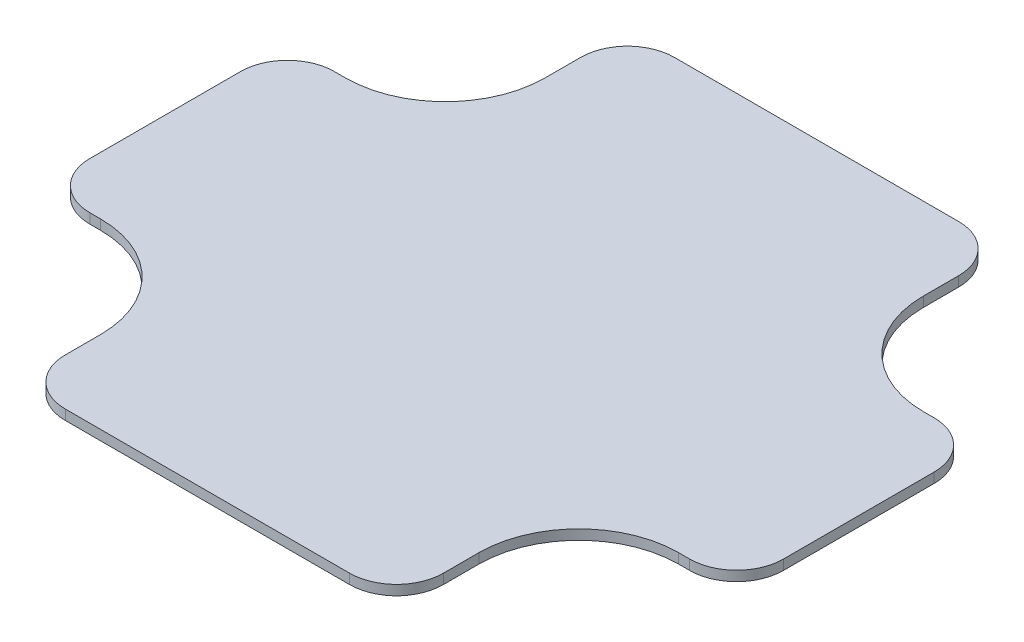
ISO-10303-21;
HEADER;
FILE_DESCRIPTION(('STEP AP214'),'2;1');
FILE_NAME('part.step','',(''),(''),'','','');
FILE_SCHEMA(('AUTOMOTIVE_DESIGN { 1 0 10303 214 1 1 1 1 }'));
ENDSEC;
DATA;
#1=APPLICATION_CONTEXT('core data for automotive mechanical design processes');
#2=APPLICATION_PROTOCOL_DEFINITION('international standard','automotive_design',2000,#1);
#3=PRODUCT_CONTEXT('',#1,'mechanical');
#4=PRODUCT('Part','Part','',(#3));
#5=PRODUCT_RELATED_PRODUCT_CATEGORY('part','',(#4));
#6=PRODUCT_DEFINITION_FORMATION('','',#4);
#7=PRODUCT_DEFINITION_CONTEXT('part definition',#1,'design');
#8=PRODUCT_DEFINITION('design','',#6,#7);
#9=PRODUCT_DEFINITION_SHAPE('','',#8);
#10=(LENGTH_UNIT() NAMED_UNIT(*) SI_UNIT(.MILLI.,.METRE.));
#11=(NAMED_UNIT(*) PLANE_ANGLE_UNIT() SI_UNIT($,.RADIAN.));
#12=(NAMED_UNIT(*) SI_UNIT($,.STERADIAN.) SOLID_ANGLE_UNIT());
#13=UNCERTAINTY_MEASURE_WITH_UNIT(LENGTH_MEASURE(1.E-05),#10,'distance_accuracy_value','');
#14=(GEOMETRIC_REPRESENTATION_CONTEXT(3) GLOBAL_UNCERTAINTY_ASSIGNED_CONTEXT((#13)) GLOBAL_UNIT_ASSIGNED_CONTEXT((#10,
#11,#12)) REPRESENTATION_CONTEXT('',''));
#15=CARTESIAN_POINT('',(0.,0.,0.));
#16=DIRECTION('',(0.,0.,1.));
#17=DIRECTION('',(1.,0.,0.));
#18=AXIS2_PLACEMENT_3D('',#15,#16,#17);
#19=CARTESIAN_POINT('',(45.5,3.175,-82.46855));
#20=DIRECTION('',(0.,-1.,0.));
#21=DIRECTION('',(0.,0.,-1.));
#22=AXIS2_PLACEMENT_3D('',#19,#20,#21);
#23=CYLINDRICAL_SURFACE('',#22,15.);
#24=CARTESIAN_POINT('',(45.5,0.,-82.46855));
#25=DIRECTION('',(0.,1.,0.));
#26=DIRECTION('',(0.,0.,1.));
#27=AXIS2_PLACEMENT_3D('',#24,#25,#26);
#28=CIRCLE('',#27,15.);
#29=CARTESIAN_POINT('',(60.5,0.,-82.46855));
#30=VERTEX_POINT('',#29);
#31=CARTESIAN_POINT('',(45.5,0.,-97.46855));
#32=VERTEX_POINT('',#31);
#33=EDGE_CURVE('E225',#30,#32,#28,.T.);
#34=ORIENTED_EDGE('',*,*,#33,.T.);
#35=DIRECTION('',(0.,-1.,0.));
#36=VECTOR('',#35,1.);
#37=CARTESIAN_POINT('',(45.5,3.175,-97.46855));
#38=LINE('',#37,#36);
#39=CARTESIAN_POINT('',(45.5,3.175,-97.46855));
#40=VERTEX_POINT('',#39);
#41=EDGE_CURVE('E11',#40,#32,#38,.T.);
#42=ORIENTED_EDGE('',*,*,#41,.F.);
#43=CARTESIAN_POINT('',(45.5,3.175,-82.46855));
#44=DIRECTION('',(0.,1.,0.));
#45=DIRECTION('',(0.,0.,1.));
#46=AXIS2_PLACEMENT_3D('',#43,#44,#45);
#47=CIRCLE('',#46,15.);
#48=CARTESIAN_POINT('',(60.5,3.175,-82.46855));
#49=VERTEX_POINT('',#48);
#50=EDGE_CURVE('E271',#49,#40,#47,.T.);
#51=ORIENTED_EDGE('',*,*,#50,.F.);
#52=DIRECTION('',(0.,-1.,0.));
#53=VECTOR('',#52,1.);
#54=CARTESIAN_POINT('',(60.5,3.175,-82.46855));
#55=LINE('',#54,#53);
#56=EDGE_CURVE('E221',#49,#30,#55,.T.);
#57=ORIENTED_EDGE('',*,*,#56,.T.);
#58=EDGE_LOOP('',(#34,#42,#51,#57));
#59=FACE_BOUND('',#58,.T.);
#60=ADVANCED_FACE('F33',(#59),#23,.T.);
#61=CARTESIAN_POINT('',(-45.5,3.175,-97.46855));
#62=DIRECTION('',(0.,0.,1.));
#63=DIRECTION('',(1.,0.,0.));
#64=AXIS2_PLACEMENT_3D('',#61,#62,#63);
#65=PLANE('',#64);
#66=DIRECTION('',(-1.,0.,0.));
#67=VECTOR('',#66,1.);
#68=CARTESIAN_POINT('',(-45.5,0.,-97.46855));
#69=LINE('',#68,#67);
#70=CARTESIAN_POINT('',(-45.5,0.,-97.46855));
#71=VERTEX_POINT('',#70);
#72=EDGE_CURVE('E228',#32,#71,#69,.T.);
#73=ORIENTED_EDGE('',*,*,#72,.T.);
#74=DIRECTION('',(0.,-1.,0.));
#75=VECTOR('',#74,1.);
#76=CARTESIAN_POINT('',(-45.5,3.175,-97.46855));
#77=LINE('',#76,#75);
#78=CARTESIAN_POINT('',(-45.5,3.175,-97.46855));
#79=VERTEX_POINT('',#78);
#80=EDGE_CURVE('E41',#79,#71,#77,.T.);
#81=ORIENTED_EDGE('',*,*,#80,.F.);
#82=DIRECTION('',(-1.,0.,0.));
#83=VECTOR('',#82,1.);
#84=CARTESIAN_POINT('',(-45.5,3.175,-97.46855));
#85=LINE('',#84,#83);
#86=EDGE_CURVE('E140',#40,#79,#85,.T.);
#87=ORIENTED_EDGE('',*,*,#86,.F.);
#88=ORIENTED_EDGE('',*,*,#41,.T.);
#89=EDGE_LOOP('',(#73,#81,#87,#88));
#90=FACE_BOUND('',#89,.T.);
#91=ADVANCED_FACE('F409',(#90),#65,.F.);
#92=CARTESIAN_POINT('',(-45.5,3.175,-82.46855));
#93=DIRECTION('',(0.,-1.,0.));
#94=DIRECTION('',(0.,0.,-1.));
#95=AXIS2_PLACEMENT_3D('',#92,#93,#94);
#96=CYLINDRICAL_SURFACE('',#95,15.);
#97=CARTESIAN_POINT('',(-45.5,0.,-82.46855));
#98=DIRECTION('',(0.,1.,0.));
#99=DIRECTION('',(0.,0.,-1.));
#100=AXIS2_PLACEMENT_3D('',#97,#98,#99);
#101=CIRCLE('',#100,15.);
#102=CARTESIAN_POINT('',(-60.5,0.,-82.46855));
#103=VERTEX_POINT('',#102);
#104=EDGE_CURVE('E230',#71,#103,#101,.T.);
#105=ORIENTED_EDGE('',*,*,#104,.T.);
#106=DIRECTION('',(0.,-1.,0.));
#107=VECTOR('',#106,1.);
#108=CARTESIAN_POINT('',(-60.5,3.175,-82.46855));
#109=LINE('',#108,#107);
#110=CARTESIAN_POINT('',(-60.5,3.175,-82.46855));
#111=VERTEX_POINT('',#110);
#112=EDGE_CURVE('E326',#111,#103,#109,.T.);
#113=ORIENTED_EDGE('',*,*,#112,.F.);
#114=CARTESIAN_POINT('',(-45.5,3.175,-82.46855));
#115=DIRECTION('',(0.,1.,0.));
#116=DIRECTION('',(0.,0.,-1.));
#117=AXIS2_PLACEMENT_3D('',#114,#115,#116);
#118=CIRCLE('',#117,15.);
#119=EDGE_CURVE('E334',#79,#111,#118,.T.);
#120=ORIENTED_EDGE('',*,*,#119,.F.);
#121=ORIENTED_EDGE('',*,*,#80,.T.);
#122=EDGE_LOOP('',(#105,#113,#120,#121));
#123=FACE_BOUND('',#122,.T.);
#124=ADVANCED_FACE('F332',(#123),#96,.T.);
#125=CARTESIAN_POINT('',(-60.5,3.175,-71.13235));
#126=DIRECTION('',(1.,0.,0.));
#127=DIRECTION('',(0.,0.,-1.));
#128=AXIS2_PLACEMENT_3D('',#125,#126,#127);
#129=PLANE('',#128);
#130=DIRECTION('',(0.,0.,1.));
#131=VECTOR('',#130,1.);
#132=CARTESIAN_POINT('',(-60.5,0.,-71.13235));
#133=LINE('',#132,#131);
#134=CARTESIAN_POINT('',(-60.5,0.,-71.13235));
#135=VERTEX_POINT('',#134);
#136=EDGE_CURVE('E232',#103,#135,#133,.T.);
#137=ORIENTED_EDGE('',*,*,#136,.T.);
#138=DIRECTION('',(0.,-1.,0.));
#139=VECTOR('',#138,1.);
#140=CARTESIAN_POINT('',(-60.5,3.175,-71.13235));
#141=LINE('',#140,#139);
#142=CARTESIAN_POINT('',(-60.5,3.175,-71.13235));
#143=VERTEX_POINT('',#142);
#144=EDGE_CURVE('E323',#143,#135,#141,.T.);
#145=ORIENTED_EDGE('',*,*,#144,.F.);
#146=DIRECTION('',(0.,0.,1.));
#147=VECTOR('',#146,1.);
#148=CARTESIAN_POINT('',(-60.5,3.175,-71.13235));
#149=LINE('',#148,#147);
#150=EDGE_CURVE('E352',#111,#143,#149,.T.);
#151=ORIENTED_EDGE('',*,*,#150,.F.);
#152=ORIENTED_EDGE('',*,*,#112,.T.);
#153=EDGE_LOOP('',(#137,#145,#151,#152));
#154=FACE_BOUND('',#153,.T.);
#155=ADVANCED_FACE('F343',(#154),#129,.F.);
#156=CARTESIAN_POINT('',(-92.5,3.175,-71.13235));
#157=DIRECTION('',(0.,-1.,0.));
#158=DIRECTION('',(0.,0.,-1.));
#159=AXIS2_PLACEMENT_3D('',#156,#157,#158);
#160=CYLINDRICAL_SURFACE('',#159,32.);
#161=CARTESIAN_POINT('',(-92.5,0.,-71.13235));
#162=DIRECTION('',(0.,-1.,0.));
#163=DIRECTION('',(0.,0.,1.));
#164=AXIS2_PLACEMENT_3D('',#161,#162,#163);
#165=CIRCLE('',#164,32.);
#166=CARTESIAN_POINT('',(-92.5,0.,-39.13235));
#167=VERTEX_POINT('',#166);
#168=EDGE_CURVE('E234',#135,#167,#165,.T.);
#169=ORIENTED_EDGE('',*,*,#168,.T.);
#170=DIRECTION('',(0.,-1.,0.));
#171=VECTOR('',#170,1.);
#172=CARTESIAN_POINT('',(-92.5,3.175,-39.13235));
#173=LINE('',#172,#171);
#174=CARTESIAN_POINT('',(-92.5,3.175,-39.13235));
#175=VERTEX_POINT('',#174);
#176=EDGE_CURVE('E320',#175,#167,#173,.T.);
#177=ORIENTED_EDGE('',*,*,#176,.F.);
#178=CARTESIAN_POINT('',(-92.5,3.175,-71.13235));
#179=DIRECTION('',(0.,-1.,0.));
#180=DIRECTION('',(0.,0.,1.));
#181=AXIS2_PLACEMENT_3D('',#178,#179,#180);
#182=CIRCLE('',#181,32.);
#183=EDGE_CURVE('E349',#143,#175,#182,.T.);
#184=ORIENTED_EDGE('',*,*,#183,.F.);
#185=ORIENTED_EDGE('',*,*,#144,.T.);
#186=EDGE_LOOP('',(#169,#177,#184,#185));
#187=FACE_BOUND('',#186,.T.);
#188=ADVANCED_FACE('F347',(#187),#160,.F.);
#189=CARTESIAN_POINT('',(-96.,3.175,-39.13235));
#190=DIRECTION('',(0.,0.,1.));
#191=DIRECTION('',(1.,0.,0.));
#192=AXIS2_PLACEMENT_3D('',#189,#190,#191);
#193=PLANE('',#192);
#194=DIRECTION('',(-1.,0.,0.));
#195=VECTOR('',#194,1.);
#196=CARTESIAN_POINT('',(-96.,0.,-39.13235));
#197=LINE('',#196,#195);
#198=CARTESIAN_POINT('',(-96.,0.,-39.13235));
#199=VERTEX_POINT('',#198);
#200=EDGE_CURVE('E236',#167,#199,#197,.T.);
#201=ORIENTED_EDGE('',*,*,#200,.T.);
#202=DIRECTION('',(0.,-1.,0.));
#203=VECTOR('',#202,1.);
#204=CARTESIAN_POINT('',(-96.,3.175,-39.13235));
#205=LINE('',#204,#203);
#206=CARTESIAN_POINT('',(-96.,3.175,-39.13235));
#207=VERTEX_POINT('',#206);
#208=EDGE_CURVE('E317',#207,#199,#205,.T.);
#209=ORIENTED_EDGE('',*,*,#208,.F.);
#210=DIRECTION('',(-1.,0.,0.));
#211=VECTOR('',#210,1.);
#212=CARTESIAN_POINT('',(-96.,3.175,-39.13235));
#213=LINE('',#212,#211);
#214=EDGE_CURVE('E351',#175,#207,#213,.T.);
#215=ORIENTED_EDGE('',*,*,#214,.F.);
#216=ORIENTED_EDGE('',*,*,#176,.T.);
#217=EDGE_LOOP('',(#201,#209,#215,#216));
#218=FACE_BOUND('',#217,.T.);
#219=ADVANCED_FACE('F422',(#218),#193,.F.);
#220=CARTESIAN_POINT('',(-96.,3.175,-24.13235));
#221=DIRECTION('',(0.,-1.,0.));
#222=DIRECTION('',(0.,0.,-1.));
#223=AXIS2_PLACEMENT_3D('',#220,#221,#222);
#224=CYLINDRICAL_SURFACE('',#223,15.);
#225=CARTESIAN_POINT('',(-96.,0.,-24.13235));
#226=DIRECTION('',(0.,1.,0.));
#227=DIRECTION('',(0.,0.,-1.));
#228=AXIS2_PLACEMENT_3D('',#225,#226,#227);
#229=CIRCLE('',#228,15.);
#230=CARTESIAN_POINT('',(-111.,0.,-24.13235));
#231=VERTEX_POINT('',#230);
#232=EDGE_CURVE('E238',#199,#231,#229,.T.);
#233=ORIENTED_EDGE('',*,*,#232,.T.);
#234=DIRECTION('',(0.,-1.,0.));
#235=VECTOR('',#234,1.);
#236=CARTESIAN_POINT('',(-111.,3.175,-24.13235));
#237=LINE('',#236,#235);
#238=CARTESIAN_POINT('',(-111.,3.175,-24.13235));
#239=VERTEX_POINT('',#238);
#240=EDGE_CURVE('E314',#239,#231,#237,.T.);
#241=ORIENTED_EDGE('',*,*,#240,.F.);
#242=CARTESIAN_POINT('',(-96.,3.175,-24.13235));
#243=DIRECTION('',(0.,1.,0.));
#244=DIRECTION('',(0.,0.,-1.));
#245=AXIS2_PLACEMENT_3D('',#242,#243,#244);
#246=CIRCLE('',#245,15.);
#247=EDGE_CURVE('E354',#207,#239,#246,.T.);
#248=ORIENTED_EDGE('',*,*,#247,.F.);
#249=ORIENTED_EDGE('',*,*,#208,.T.);
#250=EDGE_LOOP('',(#233,#241,#248,#249));
#251=FACE_BOUND('',#250,.T.);
#252=ADVANCED_FACE('F425',(#251),#224,.T.);
#253=CARTESIAN_POINT('',(-111.,3.175,24.13235));
#254=DIRECTION('',(1.,0.,0.));
#255=DIRECTION('',(0.,0.,-1.));
#256=AXIS2_PLACEMENT_3D('',#253,#254,#255);
#257=PLANE('',#256);
#258=DIRECTION('',(0.,0.,1.));
#259=VECTOR('',#258,1.);
#260=CARTESIAN_POINT('',(-111.,0.,24.13235));
#261=LINE('',#260,#259);
#262=CARTESIAN_POINT('',(-111.,0.,24.13235));
#263=VERTEX_POINT('',#262);
#264=EDGE_CURVE('E240',#231,#263,#261,.T.);
#265=ORIENTED_EDGE('',*,*,#264,.T.);
#266=DIRECTION('',(0.,-1.,0.));
#267=VECTOR('',#266,1.);
#268=CARTESIAN_POINT('',(-111.,3.175,24.13235));
#269=LINE('',#268,#267);
#270=CARTESIAN_POINT('',(-111.,3.175,24.13235));
#271=VERTEX_POINT('',#270);
#272=EDGE_CURVE('E311',#271,#263,#269,.T.);
#273=ORIENTED_EDGE('',*,*,#272,.F.);
#274=DIRECTION('',(0.,0.,1.));
#275=VECTOR('',#274,1.);
#276=CARTESIAN_POINT('',(-111.,3.175,24.13235));
#277=LINE('',#276,#275);
#278=EDGE_CURVE('E360',#239,#271,#277,.T.);
#279=ORIENTED_EDGE('',*,*,#278,.F.);
#280=ORIENTED_EDGE('',*,*,#240,.T.);
#281=EDGE_LOOP('',(#265,#273,#279,#280));
#282=FACE_BOUND('',#281,.T.);
#283=ADVANCED_FACE('F429',(#282),#257,.F.);
#284=CARTESIAN_POINT('',(-96.,3.175,24.13235));
#285=DIRECTION('',(0.,-1.,0.));
#286=DIRECTION('',(0.,0.,-1.));
#287=AXIS2_PLACEMENT_3D('',#284,#285,#286);
#288=CYLINDRICAL_SURFACE('',#287,15.);
#289=CARTESIAN_POINT('',(-96.,0.,24.13235));
#290=DIRECTION('',(0.,1.,0.));
#291=DIRECTION('',(0.,0.,1.));
#292=AXIS2_PLACEMENT_3D('',#289,#290,#291);
#293=CIRCLE('',#292,15.);
#294=CARTESIAN_POINT('',(-96.,0.,39.13235));
#295=VERTEX_POINT('',#294);
#296=EDGE_CURVE('E242',#263,#295,#293,.T.);
#297=ORIENTED_EDGE('',*,*,#296,.T.);
#298=DIRECTION('',(0.,-1.,0.));
#299=VECTOR('',#298,1.);
#300=CARTESIAN_POINT('',(-96.,3.175,39.13235));
#301=LINE('',#300,#299);
#302=CARTESIAN_POINT('',(-96.,3.175,39.13235));
#303=VERTEX_POINT('',#302);
#304=EDGE_CURVE('E308',#303,#295,#301,.T.);
#305=ORIENTED_EDGE('',*,*,#304,.F.);
#306=CARTESIAN_POINT('',(-96.,3.175,24.13235));
#307=DIRECTION('',(0.,1.,0.));
#308=DIRECTION('',(0.,0.,1.));
#309=AXIS2_PLACEMENT_3D('',#306,#307,#308);
#310=CIRCLE('',#309,15.);
#311=EDGE_CURVE('E362',#271,#303,#310,.T.);
#312=ORIENTED_EDGE('',*,*,#311,.F.);
#313=ORIENTED_EDGE('',*,*,#272,.T.);
#314=EDGE_LOOP('',(#297,#305,#312,#313));
#315=FACE_BOUND('',#314,.T.);
#316=ADVANCED_FACE('F433',(#315),#288,.T.);
#317=CARTESIAN_POINT('',(-96.,3.175,39.13235));
#318=DIRECTION('',(0.,0.,-1.));
#319=DIRECTION('',(-1.,0.,0.));
#320=AXIS2_PLACEMENT_3D('',#317,#318,#319);
#321=PLANE('',#320);
#322=DIRECTION('',(1.,0.,0.));
#323=VECTOR('',#322,1.);
#324=CARTESIAN_POINT('',(-96.,0.,39.13235));
#325=LINE('',#324,#323);
#326=CARTESIAN_POINT('',(-92.5,0.,39.13235));
#327=VERTEX_POINT('',#326);
#328=EDGE_CURVE('E244',#295,#327,#325,.T.);
#329=ORIENTED_EDGE('',*,*,#328,.T.);
#330=DIRECTION('',(0.,-1.,0.));
#331=VECTOR('',#330,1.);
#332=CARTESIAN_POINT('',(-92.5,3.175,39.13235));
#333=LINE('',#332,#331);
#334=CARTESIAN_POINT('',(-92.5,3.175,39.13235));
#335=VERTEX_POINT('',#334);
#336=EDGE_CURVE('E305',#335,#327,#333,.T.);
#337=ORIENTED_EDGE('',*,*,#336,.F.);
#338=DIRECTION('',(1.,0.,0.));
#339=VECTOR('',#338,1.);
#340=CARTESIAN_POINT('',(-96.,3.175,39.13235));
#341=LINE('',#340,#339);
#342=EDGE_CURVE('E364',#303,#335,#341,.T.);
#343=ORIENTED_EDGE('',*,*,#342,.F.);
#344=ORIENTED_EDGE('',*,*,#304,.T.);
#345=EDGE_LOOP('',(#329,#337,#343,#344));
#346=FACE_BOUND('',#345,.T.);
#347=ADVANCED_FACE('F437',(#346),#321,.F.);
#348=CARTESIAN_POINT('',(-92.5,3.175,71.13235));
#349=DIRECTION('',(0.,-1.,0.));
#350=DIRECTION('',(0.,0.,-1.));
#351=AXIS2_PLACEMENT_3D('',#348,#349,#350);
#352=CYLINDRICAL_SURFACE('',#351,32.);
#353=CARTESIAN_POINT('',(-92.5,0.,71.13235));
#354=DIRECTION('',(0.,-1.,0.));
#355=DIRECTION('',(0.,0.,-1.));
#356=AXIS2_PLACEMENT_3D('',#353,#354,#355);
#357=CIRCLE('',#356,32.);
#358=CARTESIAN_POINT('',(-60.5,0.,71.13235));
#359=VERTEX_POINT('',#358);
#360=EDGE_CURVE('E246',#327,#359,#357,.T.);
#361=ORIENTED_EDGE('',*,*,#360,.T.);
#362=DIRECTION('',(0.,-1.,0.));
#363=VECTOR('',#362,1.);
#364=CARTESIAN_POINT('',(-60.5,3.175,71.13235));
#365=LINE('',#364,#363);
#366=CARTESIAN_POINT('',(-60.5,3.175,71.13235));
#367=VERTEX_POINT('',#366);
#368=EDGE_CURVE('E302',#367,#359,#365,.T.);
#369=ORIENTED_EDGE('',*,*,#368,.F.);
#370=CARTESIAN_POINT('',(-92.5,3.175,71.13235));
#371=DIRECTION('',(0.,-1.,0.));
#372=DIRECTION('',(0.,0.,-1.));
#373=AXIS2_PLACEMENT_3D('',#370,#371,#372);
#374=CIRCLE('',#373,32.);
#375=EDGE_CURVE('E366',#335,#367,#374,.T.);
#376=ORIENTED_EDGE('',*,*,#375,.F.);
#377=ORIENTED_EDGE('',*,*,#336,.T.);
#378=EDGE_LOOP('',(#361,#369,#376,#377));
#379=FACE_BOUND('',#378,.T.);
#380=ADVANCED_FACE('F441',(#379),#352,.F.);
#381=CARTESIAN_POINT('',(-60.5,3.175,71.13235));
#382=DIRECTION('',(1.,0.,0.));
#383=DIRECTION('',(0.,0.,-1.));
#384=AXIS2_PLACEMENT_3D('',#381,#382,#383);
#385=PLANE('',#384);
#386=DIRECTION('',(0.,0.,1.));
#387=VECTOR('',#386,1.);
#388=CARTESIAN_POINT('',(-60.5,0.,71.13235));
#389=LINE('',#388,#387);
#390=CARTESIAN_POINT('',(-60.5,0.,82.46855));
#391=VERTEX_POINT('',#390);
#392=EDGE_CURVE('E248',#359,#391,#389,.T.);
#393=ORIENTED_EDGE('',*,*,#392,.T.);
#394=DIRECTION('',(0.,-1.,0.));
#395=VECTOR('',#394,1.);
#396=CARTESIAN_POINT('',(-60.5,3.175,82.46855));
#397=LINE('',#396,#395);
#398=CARTESIAN_POINT('',(-60.5,3.175,82.46855));
#399=VERTEX_POINT('',#398);
#400=EDGE_CURVE('E299',#399,#391,#397,.T.);
#401=ORIENTED_EDGE('',*,*,#400,.F.);
#402=DIRECTION('',(0.,0.,1.));
#403=VECTOR('',#402,1.);
#404=CARTESIAN_POINT('',(-60.5,3.175,71.13235));
#405=LINE('',#404,#403);
#406=EDGE_CURVE('E368',#367,#399,#405,.T.);
#407=ORIENTED_EDGE('',*,*,#406,.F.);
#408=ORIENTED_EDGE('',*,*,#368,.T.);
#409=EDGE_LOOP('',(#393,#401,#407,#408));
#410=FACE_BOUND('',#409,.T.);
#411=ADVANCED_FACE('F445',(#410),#385,.F.);
#412=CARTESIAN_POINT('',(-45.5,3.175,82.46855));
#413=DIRECTION('',(0.,-1.,0.));
#414=DIRECTION('',(0.,0.,-1.));
#415=AXIS2_PLACEMENT_3D('',#412,#413,#414);
#416=CYLINDRICAL_SURFACE('',#415,15.0000000000001);
#417=CARTESIAN_POINT('',(-45.5,0.,82.46855));
#418=DIRECTION('',(0.,1.,0.));
#419=DIRECTION('',(0.,0.,1.));
#420=AXIS2_PLACEMENT_3D('',#417,#418,#419);
#421=CIRCLE('',#420,15.0000000000001);
#422=CARTESIAN_POINT('',(-45.5,0.,97.4685500000001));
#423=VERTEX_POINT('',#422);
#424=EDGE_CURVE('E250',#391,#423,#421,.T.);
#425=ORIENTED_EDGE('',*,*,#424,.T.);
#426=DIRECTION('',(0.,-1.,0.));
#427=VECTOR('',#426,1.);
#428=CARTESIAN_POINT('',(-45.5,3.175,97.4685500000001));
#429=LINE('',#428,#427);
#430=CARTESIAN_POINT('',(-45.5,3.175,97.4685500000001));
#431=VERTEX_POINT('',#430);
#432=EDGE_CURVE('E296',#431,#423,#429,.T.);
#433=ORIENTED_EDGE('',*,*,#432,.F.);
#434=CARTESIAN_POINT('',(-45.5,3.175,82.46855));
#435=DIRECTION('',(0.,1.,0.));
#436=DIRECTION('',(0.,0.,1.));
#437=AXIS2_PLACEMENT_3D('',#434,#435,#436);
#438=CIRCLE('',#437,15.0000000000001);
#439=EDGE_CURVE('E370',#399,#431,#438,.T.);
#440=ORIENTED_EDGE('',*,*,#439,.F.);
#441=ORIENTED_EDGE('',*,*,#400,.T.);
#442=EDGE_LOOP('',(#425,#433,#440,#441));
#443=FACE_BOUND('',#442,.T.);
#444=ADVANCED_FACE('F449',(#443),#416,.T.);
#445=CARTESIAN_POINT('',(-45.5,3.175,97.4685500000003));
#446=DIRECTION('',(0.,0.,-1.));
#447=DIRECTION('',(-1.,0.,0.));
#448=AXIS2_PLACEMENT_3D('',#445,#446,#447);
#449=PLANE('',#448);
#450=DIRECTION('',(1.,0.,0.));
#451=VECTOR('',#450,1.);
#452=CARTESIAN_POINT('',(-45.5,0.,97.4685500000003));
#453=LINE('',#452,#451);
#454=CARTESIAN_POINT('',(45.5000000000001,0.,97.4685500000002));
#455=VERTEX_POINT('',#454);
#456=EDGE_CURVE('E252',#423,#455,#453,.T.);
#457=ORIENTED_EDGE('',*,*,#456,.T.);
#458=DIRECTION('',(0.,-1.,0.));
#459=VECTOR('',#458,1.);
#460=CARTESIAN_POINT('',(45.5000000000001,3.175,97.4685500000002));
#461=LINE('',#460,#459);
#462=CARTESIAN_POINT('',(45.5000000000001,3.175,97.4685500000002));
#463=VERTEX_POINT('',#462);
#464=EDGE_CURVE('E293',#463,#455,#461,.T.);
#465=ORIENTED_EDGE('',*,*,#464,.F.);
#466=DIRECTION('',(1.,0.,0.));
#467=VECTOR('',#466,1.);
#468=CARTESIAN_POINT('',(-45.5,3.175,97.4685500000003));
#469=LINE('',#468,#467);
#470=EDGE_CURVE('E372',#431,#463,#469,.T.);
#471=ORIENTED_EDGE('',*,*,#470,.F.);
#472=ORIENTED_EDGE('',*,*,#432,.T.);
#473=EDGE_LOOP('',(#457,#465,#471,#472));
#474=FACE_BOUND('',#473,.T.);
#475=ADVANCED_FACE('F453',(#474),#449,.F.);
#476=CARTESIAN_POINT('',(45.5,3.175,82.46855));
#477=DIRECTION('',(0.,-1.,0.));
#478=DIRECTION('',(0.,0.,-1.));
#479=AXIS2_PLACEMENT_3D('',#476,#477,#478);
#480=CYLINDRICAL_SURFACE('',#479,15.0000000000001);
#481=CARTESIAN_POINT('',(45.5,0.,82.46855));
#482=DIRECTION('',(0.,1.,0.));
#483=DIRECTION('',(0.,0.,-1.));
#484=AXIS2_PLACEMENT_3D('',#481,#482,#483);
#485=CIRCLE('',#484,15.0000000000001);
#486=CARTESIAN_POINT('',(60.5000000000001,0.,82.46855));
#487=VERTEX_POINT('',#486);
#488=EDGE_CURVE('E254',#455,#487,#485,.T.);
#489=ORIENTED_EDGE('',*,*,#488,.T.);
#490=DIRECTION('',(0.,-1.,0.));
#491=VECTOR('',#490,1.);
#492=CARTESIAN_POINT('',(60.5000000000001,3.175,82.46855));
#493=LINE('',#492,#491);
#494=CARTESIAN_POINT('',(60.5000000000001,3.175,82.46855));
#495=VERTEX_POINT('',#494);
#496=EDGE_CURVE('E290',#495,#487,#493,.T.);
#497=ORIENTED_EDGE('',*,*,#496,.F.);
#498=CARTESIAN_POINT('',(45.5,3.175,82.46855));
#499=DIRECTION('',(0.,1.,0.));
#500=DIRECTION('',(0.,0.,-1.));
#501=AXIS2_PLACEMENT_3D('',#498,#499,#500);
#502=CIRCLE('',#501,15.0000000000001);
#503=EDGE_CURVE('E374',#463,#495,#502,.T.);
#504=ORIENTED_EDGE('',*,*,#503,.F.);
#505=ORIENTED_EDGE('',*,*,#464,.T.);
#506=EDGE_LOOP('',(#489,#497,#504,#505));
#507=FACE_BOUND('',#506,.T.);
#508=ADVANCED_FACE('F457',(#507),#480,.T.);
#509=CARTESIAN_POINT('',(60.5,3.175,71.13235));
#510=DIRECTION('',(-1.,0.,0.));
#511=DIRECTION('',(0.,0.,1.));
#512=AXIS2_PLACEMENT_3D('',#509,#510,#511);
#513=PLANE('',#512);
#514=DIRECTION('',(0.,0.,-1.));
#515=VECTOR('',#514,1.);
#516=CARTESIAN_POINT('',(60.5,0.,71.13235));
#517=LINE('',#516,#515);
#518=CARTESIAN_POINT('',(60.5,0.,71.13235));
#519=VERTEX_POINT('',#518);
#520=EDGE_CURVE('E256',#487,#519,#517,.T.);
#521=ORIENTED_EDGE('',*,*,#520,.T.);
#522=DIRECTION('',(0.,-1.,0.));
#523=VECTOR('',#522,1.);
#524=CARTESIAN_POINT('',(60.5,3.175,71.13235));
#525=LINE('',#524,#523);
#526=CARTESIAN_POINT('',(60.5,3.175,71.13235));
#527=VERTEX_POINT('',#526);
#528=EDGE_CURVE('E287',#527,#519,#525,.T.);
#529=ORIENTED_EDGE('',*,*,#528,.F.);
#530=DIRECTION('',(0.,0.,-1.));
#531=VECTOR('',#530,1.);
#532=CARTESIAN_POINT('',(60.5,3.175,71.13235));
#533=LINE('',#532,#531);
#534=EDGE_CURVE('E376',#495,#527,#533,.T.);
#535=ORIENTED_EDGE('',*,*,#534,.F.);
#536=ORIENTED_EDGE('',*,*,#496,.T.);
#537=EDGE_LOOP('',(#521,#529,#535,#536));
#538=FACE_BOUND('',#537,.T.);
#539=ADVANCED_FACE('F461',(#538),#513,.F.);
#540=CARTESIAN_POINT('',(92.5,3.175,71.13235));
#541=DIRECTION('',(0.,-1.,0.));
#542=DIRECTION('',(0.,0.,-1.));
#543=AXIS2_PLACEMENT_3D('',#540,#541,#542);
#544=CYLINDRICAL_SURFACE('',#543,32.);
#545=CARTESIAN_POINT('',(92.5,0.,71.13235));
#546=DIRECTION('',(0.,-1.,0.));
#547=DIRECTION('',(0.,0.,1.));
#548=AXIS2_PLACEMENT_3D('',#545,#546,#547);
#549=CIRCLE('',#548,32.);
#550=CARTESIAN_POINT('',(92.5,0.,39.13235));
#551=VERTEX_POINT('',#550);
#552=EDGE_CURVE('E258',#519,#551,#549,.T.);
#553=ORIENTED_EDGE('',*,*,#552,.T.);
#554=DIRECTION('',(0.,-1.,0.));
#555=VECTOR('',#554,1.);
#556=CARTESIAN_POINT('',(92.5,3.175,39.13235));
#557=LINE('',#556,#555);
#558=CARTESIAN_POINT('',(92.5,3.175,39.13235));
#559=VERTEX_POINT('',#558);
#560=EDGE_CURVE('E284',#559,#551,#557,.T.);
#561=ORIENTED_EDGE('',*,*,#560,.F.);
#562=CARTESIAN_POINT('',(92.5,3.175,71.13235));
#563=DIRECTION('',(0.,-1.,0.));
#564=DIRECTION('',(0.,0.,1.));
#565=AXIS2_PLACEMENT_3D('',#562,#563,#564);
#566=CIRCLE('',#565,32.);
#567=EDGE_CURVE('E378',#527,#559,#566,.T.);
#568=ORIENTED_EDGE('',*,*,#567,.F.);
#569=ORIENTED_EDGE('',*,*,#528,.T.);
#570=EDGE_LOOP('',(#553,#561,#568,#569));
#571=FACE_BOUND('',#570,.T.);
#572=ADVANCED_FACE('F465',(#571),#544,.F.);
#573=CARTESIAN_POINT('',(96.,3.175,39.13235));
#574=DIRECTION('',(0.,0.,-1.));
#575=DIRECTION('',(-1.,0.,0.));
#576=AXIS2_PLACEMENT_3D('',#573,#574,#575);
#577=PLANE('',#576);
#578=DIRECTION('',(1.,0.,0.));
#579=VECTOR('',#578,1.);
#580=CARTESIAN_POINT('',(96.,0.,39.13235));
#581=LINE('',#580,#579);
#582=CARTESIAN_POINT('',(96.,0.,39.13235));
#583=VERTEX_POINT('',#582);
#584=EDGE_CURVE('E260',#551,#583,#581,.T.);
#585=ORIENTED_EDGE('',*,*,#584,.T.);
#586=DIRECTION('',(0.,-1.,0.));
#587=VECTOR('',#586,1.);
#588=CARTESIAN_POINT('',(96.,3.175,39.13235));
#589=LINE('',#588,#587);
#590=CARTESIAN_POINT('',(96.,3.175,39.13235));
#591=VERTEX_POINT('',#590);
#592=EDGE_CURVE('E281',#591,#583,#589,.T.);
#593=ORIENTED_EDGE('',*,*,#592,.F.);
#594=DIRECTION('',(1.,0.,0.));
#595=VECTOR('',#594,1.);
#596=CARTESIAN_POINT('',(96.,3.175,39.13235));
#597=LINE('',#596,#595);
#598=EDGE_CURVE('E380',#559,#591,#597,.T.);
#599=ORIENTED_EDGE('',*,*,#598,.F.);
#600=ORIENTED_EDGE('',*,*,#560,.T.);
#601=EDGE_LOOP('',(#585,#593,#599,#600));
#602=FACE_BOUND('',#601,.T.);
#603=ADVANCED_FACE('F469',(#602),#577,.F.);
#604=CARTESIAN_POINT('',(96.,3.175,24.13235));
#605=DIRECTION('',(0.,-1.,0.));
#606=DIRECTION('',(0.,0.,-1.));
#607=AXIS2_PLACEMENT_3D('',#604,#605,#606);
#608=CYLINDRICAL_SURFACE('',#607,15.);
#609=CARTESIAN_POINT('',(96.,0.,24.13235));
#610=DIRECTION('',(0.,1.,0.));
#611=DIRECTION('',(0.,0.,-1.));
#612=AXIS2_PLACEMENT_3D('',#609,#610,#611);
#613=CIRCLE('',#612,15.);
#614=CARTESIAN_POINT('',(111.,0.,24.13235));
#615=VERTEX_POINT('',#614);
#616=EDGE_CURVE('E262',#583,#615,#613,.T.);
#617=ORIENTED_EDGE('',*,*,#616,.T.);
#618=DIRECTION('',(0.,-1.,0.));
#619=VECTOR('',#618,1.);
#620=CARTESIAN_POINT('',(111.,3.175,24.13235));
#621=LINE('',#620,#619);
#622=CARTESIAN_POINT('',(111.,3.175,24.13235));
#623=VERTEX_POINT('',#622);
#624=EDGE_CURVE('E278',#623,#615,#621,.T.);
#625=ORIENTED_EDGE('',*,*,#624,.F.);
#626=CARTESIAN_POINT('',(96.,3.175,24.13235));
#627=DIRECTION('',(0.,1.,0.));
#628=DIRECTION('',(0.,0.,-1.));
#629=AXIS2_PLACEMENT_3D('',#626,#627,#628);
#630=CIRCLE('',#629,15.);
#631=EDGE_CURVE('E382',#591,#623,#630,.T.);
#632=ORIENTED_EDGE('',*,*,#631,.F.);
#633=ORIENTED_EDGE('',*,*,#592,.T.);
#634=EDGE_LOOP('',(#617,#625,#632,#633));
#635=FACE_BOUND('',#634,.T.);
#636=ADVANCED_FACE('F473',(#635),#608,.T.);
#637=CARTESIAN_POINT('',(111.,3.175,24.13235));
#638=DIRECTION('',(-1.,0.,0.));
#639=DIRECTION('',(0.,0.,1.));
#640=AXIS2_PLACEMENT_3D('',#637,#638,#639);
#641=PLANE('',#640);
#642=DIRECTION('',(0.,0.,-1.));
#643=VECTOR('',#642,1.);
#644=CARTESIAN_POINT('',(111.,0.,24.13235));
#645=LINE('',#644,#643);
#646=CARTESIAN_POINT('',(111.,0.,-24.13235));
#647=VERTEX_POINT('',#646);
#648=EDGE_CURVE('E264',#615,#647,#645,.T.);
#649=ORIENTED_EDGE('',*,*,#648,.T.);
#650=DIRECTION('',(0.,-1.,0.));
#651=VECTOR('',#650,1.);
#652=CARTESIAN_POINT('',(111.,3.175,-24.13235));
#653=LINE('',#652,#651);
#654=CARTESIAN_POINT('',(111.,3.175,-24.13235));
#655=VERTEX_POINT('',#654);
#656=EDGE_CURVE('E275',#655,#647,#653,.T.);
#657=ORIENTED_EDGE('',*,*,#656,.F.);
#658=DIRECTION('',(0.,0.,-1.));
#659=VECTOR('',#658,1.);
#660=CARTESIAN_POINT('',(111.,3.175,24.13235));
#661=LINE('',#660,#659);
#662=EDGE_CURVE('E384',#623,#655,#661,.T.);
#663=ORIENTED_EDGE('',*,*,#662,.F.);
#664=ORIENTED_EDGE('',*,*,#624,.T.);
#665=EDGE_LOOP('',(#649,#657,#663,#664));
#666=FACE_BOUND('',#665,.T.);
#667=ADVANCED_FACE('F390',(#666),#641,.F.);
#668=CARTESIAN_POINT('',(96.,3.175,-24.13235));
#669=DIRECTION('',(0.,-1.,0.));
#670=DIRECTION('',(0.,0.,-1.));
#671=AXIS2_PLACEMENT_3D('',#668,#669,#670);
#672=CYLINDRICAL_SURFACE('',#671,15.);
#673=CARTESIAN_POINT('',(96.,0.,-24.13235));
#674=DIRECTION('',(0.,1.,0.));
#675=DIRECTION('',(0.,0.,1.));
#676=AXIS2_PLACEMENT_3D('',#673,#674,#675);
#677=CIRCLE('',#676,15.);
#678=CARTESIAN_POINT('',(96.,0.,-39.13235));
#679=VERTEX_POINT('',#678);
#680=EDGE_CURVE('E266',#647,#679,#677,.T.);
#681=ORIENTED_EDGE('',*,*,#680,.T.);
#682=DIRECTION('',(0.,-1.,0.));
#683=VECTOR('',#682,1.);
#684=CARTESIAN_POINT('',(96.,3.175,-39.13235));
#685=LINE('',#684,#683);
#686=CARTESIAN_POINT('',(96.,3.175,-39.13235));
#687=VERTEX_POINT('',#686);
#688=EDGE_CURVE('E216',#687,#679,#685,.T.);
#689=ORIENTED_EDGE('',*,*,#688,.F.);
#690=CARTESIAN_POINT('',(96.,3.175,-24.13235));
#691=DIRECTION('',(0.,1.,0.));
#692=DIRECTION('',(0.,0.,1.));
#693=AXIS2_PLACEMENT_3D('',#690,#691,#692);
#694=CIRCLE('',#693,15.);
#695=EDGE_CURVE('E207',#655,#687,#694,.T.);
#696=ORIENTED_EDGE('',*,*,#695,.F.);
#697=ORIENTED_EDGE('',*,*,#656,.T.);
#698=EDGE_LOOP('',(#681,#689,#696,#697));
#699=FACE_BOUND('',#698,.T.);
#700=ADVANCED_FACE('F394',(#699),#672,.T.);
#701=CARTESIAN_POINT('',(96.,3.175,-39.13235));
#702=DIRECTION('',(0.,0.,1.));
#703=DIRECTION('',(1.,0.,0.));
#704=AXIS2_PLACEMENT_3D('',#701,#702,#703);
#705=PLANE('',#704);
#706=DIRECTION('',(-1.,0.,0.));
#707=VECTOR('',#706,1.);
#708=CARTESIAN_POINT('',(96.,0.,-39.13235));
#709=LINE('',#708,#707);
#710=CARTESIAN_POINT('',(92.5,0.,-39.13235));
#711=VERTEX_POINT('',#710);
#712=EDGE_CURVE('E215',#679,#711,#709,.T.);
#713=ORIENTED_EDGE('',*,*,#712,.T.);
#714=DIRECTION('',(0.,-1.,0.));
#715=VECTOR('',#714,1.);
#716=CARTESIAN_POINT('',(92.5,3.175,-39.13235));
#717=LINE('',#716,#715);
#718=CARTESIAN_POINT('',(92.5,3.175,-39.13235));
#719=VERTEX_POINT('',#718);
#720=EDGE_CURVE('E212',#719,#711,#717,.T.);
#721=ORIENTED_EDGE('',*,*,#720,.F.);
#722=DIRECTION('',(-1.,0.,0.));
#723=VECTOR('',#722,1.);
#724=CARTESIAN_POINT('',(96.,3.175,-39.13235));
#725=LINE('',#724,#723);
#726=EDGE_CURVE('E201',#687,#719,#725,.T.);
#727=ORIENTED_EDGE('',*,*,#726,.F.);
#728=ORIENTED_EDGE('',*,*,#688,.T.);
#729=EDGE_LOOP('',(#713,#721,#727,#728));
#730=FACE_BOUND('',#729,.T.);
#731=ADVANCED_FACE('F213',(#730),#705,.F.);
#732=CARTESIAN_POINT('',(92.5,3.175,-71.13235));
#733=DIRECTION('',(0.,-1.,0.));
#734=DIRECTION('',(0.,0.,-1.));
#735=AXIS2_PLACEMENT_3D('',#732,#733,#734);
#736=CYLINDRICAL_SURFACE('',#735,32.);
#737=CARTESIAN_POINT('',(92.5,0.,-71.13235));
#738=DIRECTION('',(0.,-1.,0.));
#739=DIRECTION('',(0.,0.,-1.));
#740=AXIS2_PLACEMENT_3D('',#737,#738,#739);
#741=CIRCLE('',#740,32.);
#742=CARTESIAN_POINT('',(60.5,0.,-71.13235));
#743=VERTEX_POINT('',#742);
#744=EDGE_CURVE('E126',#711,#743,#741,.T.);
#745=ORIENTED_EDGE('',*,*,#744,.T.);
#746=DIRECTION('',(0.,-1.,0.));
#747=VECTOR('',#746,1.);
#748=CARTESIAN_POINT('',(60.5,3.175,-71.13235));
#749=LINE('',#748,#747);
#750=CARTESIAN_POINT('',(60.5,3.175,-71.13235));
#751=VERTEX_POINT('',#750);
#752=EDGE_CURVE('E217',#751,#743,#749,.T.);
#753=ORIENTED_EDGE('',*,*,#752,.F.);
#754=CARTESIAN_POINT('',(92.5,3.175,-71.13235));
#755=DIRECTION('',(0.,-1.,0.));
#756=DIRECTION('',(0.,0.,-1.));
#757=AXIS2_PLACEMENT_3D('',#754,#755,#756);
#758=CIRCLE('',#757,32.);
#759=EDGE_CURVE('E205',#719,#751,#758,.T.);
#760=ORIENTED_EDGE('',*,*,#759,.F.);
#761=ORIENTED_EDGE('',*,*,#720,.T.);
#762=EDGE_LOOP('',(#745,#753,#760,#761));
#763=FACE_BOUND('',#762,.T.);
#764=ADVANCED_FACE('F219',(#763),#736,.F.);
#765=CARTESIAN_POINT('',(60.5,3.175,-71.13235));
#766=DIRECTION('',(-1.,0.,0.));
#767=DIRECTION('',(0.,0.,1.));
#768=AXIS2_PLACEMENT_3D('',#765,#766,#767);
#769=PLANE('',#768);
#770=DIRECTION('',(0.,0.,-1.));
#771=VECTOR('',#770,1.);
#772=CARTESIAN_POINT('',(60.5,0.,-71.13235));
#773=LINE('',#772,#771);
#774=EDGE_CURVE('E132',#743,#30,#773,.T.);
#775=ORIENTED_EDGE('',*,*,#774,.T.);
#776=ORIENTED_EDGE('',*,*,#56,.F.);
#777=DIRECTION('',(0.,0.,-1.));
#778=VECTOR('',#777,1.);
#779=CARTESIAN_POINT('',(60.5,3.175,-71.13235));
#780=LINE('',#779,#778);
#781=EDGE_CURVE('E49',#751,#49,#780,.T.);
#782=ORIENTED_EDGE('',*,*,#781,.F.);
#783=ORIENTED_EDGE('',*,*,#752,.T.);
#784=EDGE_LOOP('',(#775,#776,#782,#783));
#785=FACE_BOUND('',#784,.T.);
#786=ADVANCED_FACE('F398',(#785),#769,.F.);
#787=CARTESIAN_POINT('',(45.5,3.175,-82.46855));
#788=DIRECTION('',(0.,1.,0.));
#789=DIRECTION('',(0.,0.,1.));
#790=AXIS2_PLACEMENT_3D('',#787,#788,#789);
#791=PLANE('',#790);
#792=ORIENTED_EDGE('',*,*,#50,.T.);
#793=ORIENTED_EDGE('',*,*,#86,.T.);
#794=ORIENTED_EDGE('',*,*,#119,.T.);
#795=ORIENTED_EDGE('',*,*,#150,.T.);
#796=ORIENTED_EDGE('',*,*,#183,.T.);
#797=ORIENTED_EDGE('',*,*,#214,.T.);
#798=ORIENTED_EDGE('',*,*,#247,.T.);
#799=ORIENTED_EDGE('',*,*,#278,.T.);
#800=ORIENTED_EDGE('',*,*,#311,.T.);
#801=ORIENTED_EDGE('',*,*,#342,.T.);
#802=ORIENTED_EDGE('',*,*,#375,.T.);
#803=ORIENTED_EDGE('',*,*,#406,.T.);
#804=ORIENTED_EDGE('',*,*,#439,.T.);
#805=ORIENTED_EDGE('',*,*,#470,.T.);
#806=ORIENTED_EDGE('',*,*,#503,.T.);
#807=ORIENTED_EDGE('',*,*,#534,.T.);
#808=ORIENTED_EDGE('',*,*,#567,.T.);
#809=ORIENTED_EDGE('',*,*,#598,.T.);
#810=ORIENTED_EDGE('',*,*,#631,.T.);
#811=ORIENTED_EDGE('',*,*,#662,.T.);
#812=ORIENTED_EDGE('',*,*,#695,.T.);
#813=ORIENTED_EDGE('',*,*,#726,.T.);
#814=ORIENTED_EDGE('',*,*,#759,.T.);
#815=ORIENTED_EDGE('',*,*,#781,.T.);
#816=EDGE_LOOP('',(#792,#793,#794,#795,#796,#797,#798,#799,#800,#801,#802,#803,#804,#805,#806,
#807,#808,#809,#810,#811,#812,#813,#814,#815));
#817=FACE_BOUND('',#816,.T.);
#818=ADVANCED_FACE('F203',(#817),#791,.T.);
#819=CARTESIAN_POINT('',(45.5,0.,-82.46855));
#820=DIRECTION('',(0.,1.,0.));
#821=DIRECTION('',(0.,0.,1.));
#822=AXIS2_PLACEMENT_3D('',#819,#820,#821);
#823=PLANE('',#822);
#824=ORIENTED_EDGE('',*,*,#33,.F.);
#825=ORIENTED_EDGE('',*,*,#774,.F.);
#826=ORIENTED_EDGE('',*,*,#744,.F.);
#827=ORIENTED_EDGE('',*,*,#712,.F.);
#828=ORIENTED_EDGE('',*,*,#680,.F.);
#829=ORIENTED_EDGE('',*,*,#648,.F.);
#830=ORIENTED_EDGE('',*,*,#616,.F.);
#831=ORIENTED_EDGE('',*,*,#584,.F.);
#832=ORIENTED_EDGE('',*,*,#552,.F.);
#833=ORIENTED_EDGE('',*,*,#520,.F.);
#834=ORIENTED_EDGE('',*,*,#488,.F.);
#835=ORIENTED_EDGE('',*,*,#456,.F.);
#836=ORIENTED_EDGE('',*,*,#424,.F.);
#837=ORIENTED_EDGE('',*,*,#392,.F.);
#838=ORIENTED_EDGE('',*,*,#360,.F.);
#839=ORIENTED_EDGE('',*,*,#328,.F.);
#840=ORIENTED_EDGE('',*,*,#296,.F.);
#841=ORIENTED_EDGE('',*,*,#264,.F.);
#842=ORIENTED_EDGE('',*,*,#232,.F.);
#843=ORIENTED_EDGE('',*,*,#200,.F.);
#844=ORIENTED_EDGE('',*,*,#168,.F.);
#845=ORIENTED_EDGE('',*,*,#136,.F.);
#846=ORIENTED_EDGE('',*,*,#104,.F.);
#847=ORIENTED_EDGE('',*,*,#72,.F.);
#848=EDGE_LOOP('',(#824,#825,#826,#827,#828,#829,#830,#831,#832,#833,#834,#835,#836,#837,#838,
#839,#840,#841,#842,#843,#844,#845,#846,#847));
#849=FACE_BOUND('',#848,.T.);
#850=ADVANCED_FACE('F338',(#849),#823,.F.);
#851=CLOSED_SHELL('',(#60,#91,#124,#155,#188,#219,#252,#283,#316,#347,#380,#411,#444,#475,#508,
#539,#572,#603,#636,#667,#700,#731,#764,#786,#818,#850));
#852=MANIFOLD_SOLID_BREP('B2',#851);
#853=ADVANCED_BREP_SHAPE_REPRESENTATION('',(#18,#852),#14);
#854=SHAPE_DEFINITION_REPRESENTATION(#9,#853);
ENDSEC;
END-ISO-10303-21;
